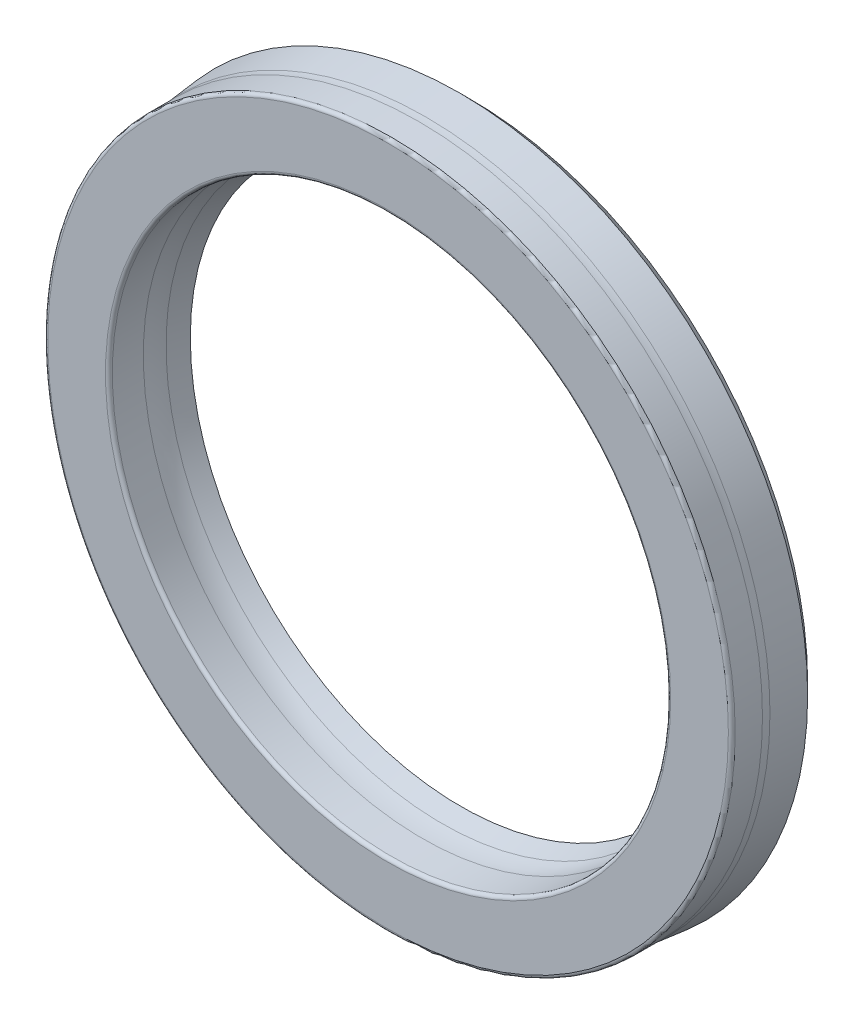
ISO-10303-21;
HEADER;
FILE_DESCRIPTION(('STEP AP214'),'2;1');
FILE_NAME('part.step','',(''),(''),'','','');
FILE_SCHEMA(('AUTOMOTIVE_DESIGN { 1 0 10303 214 1 1 1 1 }'));
ENDSEC;
DATA;
#1=APPLICATION_CONTEXT('core data for automotive mechanical design processes');
#2=APPLICATION_PROTOCOL_DEFINITION('international standard','automotive_design',2000,#1);
#3=PRODUCT_CONTEXT('',#1,'mechanical');
#4=PRODUCT('Part','Part','',(#3));
#5=PRODUCT_RELATED_PRODUCT_CATEGORY('part','',(#4));
#6=PRODUCT_DEFINITION_FORMATION('','',#4);
#7=PRODUCT_DEFINITION_CONTEXT('part definition',#1,'design');
#8=PRODUCT_DEFINITION('design','',#6,#7);
#9=PRODUCT_DEFINITION_SHAPE('','',#8);
#10=(LENGTH_UNIT() NAMED_UNIT(*) SI_UNIT(.MILLI.,.METRE.));
#11=(NAMED_UNIT(*) PLANE_ANGLE_UNIT() SI_UNIT($,.RADIAN.));
#12=(NAMED_UNIT(*) SI_UNIT($,.STERADIAN.) SOLID_ANGLE_UNIT());
#13=UNCERTAINTY_MEASURE_WITH_UNIT(LENGTH_MEASURE(1.E-05),#10,'distance_accuracy_value','');
#14=(GEOMETRIC_REPRESENTATION_CONTEXT(3) GLOBAL_UNCERTAINTY_ASSIGNED_CONTEXT((#13)) GLOBAL_UNIT_ASSIGNED_CONTEXT((#10,
#11,#12)) REPRESENTATION_CONTEXT('',''));
#15=CARTESIAN_POINT('',(0.,0.,0.));
#16=DIRECTION('',(0.,0.,1.));
#17=DIRECTION('',(1.,0.,0.));
#18=AXIS2_PLACEMENT_3D('',#15,#16,#17);
#19=CARTESIAN_POINT('',(0.,0.,-12.));
#20=DIRECTION('',(0.,0.,1.));
#21=DIRECTION('',(1.,0.,0.));
#22=AXIS2_PLACEMENT_3D('',#19,#20,#21);
#23=CONICAL_SURFACE('',#22,49.25,0.785398163397446);
#24=CARTESIAN_POINT('',(0.,0.,-10.5));
#25=DIRECTION('',(0.,0.,1.));
#26=DIRECTION('',(1.,0.,0.));
#27=AXIS2_PLACEMENT_3D('',#24,#25,#26);
#28=CIRCLE('',#27,50.75);
#29=CARTESIAN_POINT('',(50.75,0.,-10.5));
#30=VERTEX_POINT('',#29);
#31=EDGE_CURVE('E95',#30,#30,#28,.T.);
#32=ORIENTED_EDGE('',*,*,#31,.F.);
#33=EDGE_LOOP('',(#32));
#34=FACE_BOUND('',#33,.T.);
#35=CARTESIAN_POINT('',(0.,0.,-12.));
#36=DIRECTION('',(0.,0.,1.));
#37=DIRECTION('',(1.,0.,0.));
#38=AXIS2_PLACEMENT_3D('',#35,#36,#37);
#39=CIRCLE('',#38,49.25);
#40=CARTESIAN_POINT('',(49.25,0.,-12.));
#41=VERTEX_POINT('',#40);
#42=EDGE_CURVE('E10',#41,#41,#39,.T.);
#43=ORIENTED_EDGE('',*,*,#42,.T.);
#44=EDGE_LOOP('',(#43));
#45=FACE_BOUND('',#44,.T.);
#46=ADVANCED_FACE('F43',(#34,#45),#23,.T.);
#47=CARTESIAN_POINT('',(0.,49.25,-12.));
#48=DIRECTION('',(0.,0.,1.));
#49=DIRECTION('',(1.,0.,0.));
#50=AXIS2_PLACEMENT_3D('',#47,#48,#49);
#51=PLANE('',#50);
#52=ORIENTED_EDGE('',*,*,#42,.F.);
#53=EDGE_LOOP('',(#52));
#54=FACE_BOUND('',#53,.T.);
#55=CARTESIAN_POINT('',(0.,0.,-12.));
#56=DIRECTION('',(0.,0.,1.));
#57=DIRECTION('',(1.,0.,0.));
#58=AXIS2_PLACEMENT_3D('',#55,#56,#57);
#59=CIRCLE('',#58,47.5);
#60=CARTESIAN_POINT('',(47.5,0.,-12.));
#61=VERTEX_POINT('',#60);
#62=EDGE_CURVE('E49',#61,#61,#59,.T.);
#63=ORIENTED_EDGE('',*,*,#62,.T.);
#64=EDGE_LOOP('',(#63));
#65=FACE_BOUND('',#64,.T.);
#66=ADVANCED_FACE('F102',(#54,#65),#51,.F.);
#67=CARTESIAN_POINT('',(0.,0.,-7.71142950799845));
#68=DIRECTION('',(0.,0.,-1.));
#69=DIRECTION('',(-1.,0.,0.));
#70=AXIS2_PLACEMENT_3D('',#67,#68,#69);
#71=CONICAL_SURFACE('',#70,46.2074586524472,0.292733477905059);
#72=ORIENTED_EDGE('',*,*,#62,.F.);
#73=EDGE_LOOP('',(#72));
#74=FACE_BOUND('',#73,.T.);
#75=CARTESIAN_POINT('',(0.,0.,-7.71142950799845));
#76=DIRECTION('',(0.,0.,1.));
#77=DIRECTION('',(1.,0.,0.));
#78=AXIS2_PLACEMENT_3D('',#75,#76,#77);
#79=CIRCLE('',#78,46.2074586524472);
#80=CARTESIAN_POINT('',(46.2074586524472,0.,-7.71142950799845));
#81=VERTEX_POINT('',#80);
#82=EDGE_CURVE('E53',#81,#81,#79,.T.);
#83=ORIENTED_EDGE('',*,*,#82,.T.);
#84=EDGE_LOOP('',(#83));
#85=FACE_BOUND('',#84,.T.);
#86=ADVANCED_FACE('F106',(#74,#85),#71,.F.);
#87=CARTESIAN_POINT('',(0.,0.,-8.));
#88=DIRECTION('',(0.,0.,1.));
#89=DIRECTION('',(1.,0.,0.));
#90=AXIS2_PLACEMENT_3D('',#87,#88,#89);
#91=TOROIDAL_SURFACE('',#90,45.25,1.);
#92=ORIENTED_EDGE('',*,*,#82,.F.);
#93=EDGE_LOOP('',(#92));
#94=FACE_BOUND('',#93,.T.);
#95=CARTESIAN_POINT('',(0.,0.,-7.73475386609805));
#96=DIRECTION('',(0.,0.,1.));
#97=DIRECTION('',(1.,0.,0.));
#98=AXIS2_PLACEMENT_3D('',#95,#96,#97);
#99=CIRCLE('',#98,44.2858192656716);
#100=CARTESIAN_POINT('',(44.2858192656716,0.,-7.73475386609805));
#101=VERTEX_POINT('',#100);
#102=EDGE_CURVE('E57',#101,#101,#99,.T.);
#103=ORIENTED_EDGE('',*,*,#102,.T.);
#104=EDGE_LOOP('',(#103));
#105=FACE_BOUND('',#104,.T.);
#106=ADVANCED_FACE('F111',(#94,#105),#91,.F.);
#107=CARTESIAN_POINT('',(0.,0.,-11.5));
#108=DIRECTION('',(0.,0.,1.));
#109=DIRECTION('',(1.,0.,0.));
#110=AXIS2_PLACEMENT_3D('',#107,#108,#109);
#111=CONICAL_SURFACE('',#110,43.25,0.268459191123488);
#112=ORIENTED_EDGE('',*,*,#102,.F.);
#113=EDGE_LOOP('',(#112));
#114=FACE_BOUND('',#113,.T.);
#115=CARTESIAN_POINT('',(0.,0.,-11.5));
#116=DIRECTION('',(0.,0.,1.));
#117=DIRECTION('',(1.,0.,0.));
#118=AXIS2_PLACEMENT_3D('',#115,#116,#117);
#119=CIRCLE('',#118,43.25);
#120=CARTESIAN_POINT('',(43.25,0.,-11.5));
#121=VERTEX_POINT('',#120);
#122=EDGE_CURVE('E62',#121,#121,#119,.T.);
#123=ORIENTED_EDGE('',*,*,#122,.T.);
#124=EDGE_LOOP('',(#123));
#125=FACE_BOUND('',#124,.T.);
#126=ADVANCED_FACE('F117',(#114,#125),#111,.T.);
#127=CARTESIAN_POINT('',(0.,43.25,-11.5));
#128=DIRECTION('',(0.,0.,1.));
#129=DIRECTION('',(1.,0.,0.));
#130=AXIS2_PLACEMENT_3D('',#127,#128,#129);
#131=PLANE('',#130);
#132=ORIENTED_EDGE('',*,*,#122,.F.);
#133=EDGE_LOOP('',(#132));
#134=FACE_BOUND('',#133,.T.);
#135=CARTESIAN_POINT('',(0.,0.,-11.5));
#136=DIRECTION('',(0.,0.,1.));
#137=DIRECTION('',(1.,0.,0.));
#138=AXIS2_PLACEMENT_3D('',#135,#136,#137);
#139=CIRCLE('',#138,41.);
#140=CARTESIAN_POINT('',(41.,0.,-11.5));
#141=VERTEX_POINT('',#140);
#142=EDGE_CURVE('E65',#141,#141,#139,.T.);
#143=ORIENTED_EDGE('',*,*,#142,.T.);
#144=EDGE_LOOP('',(#143));
#145=FACE_BOUND('',#144,.T.);
#146=ADVANCED_FACE('F121',(#134,#145),#131,.F.);
#147=CARTESIAN_POINT('',(0.,0.,-10.6339745962156));
#148=DIRECTION('',(0.,0.,-1.));
#149=DIRECTION('',(-1.,0.,0.));
#150=AXIS2_PLACEMENT_3D('',#147,#148,#149);
#151=CONICAL_SURFACE('',#150,39.5,1.0471975511966);
#152=ORIENTED_EDGE('',*,*,#142,.F.);
#153=EDGE_LOOP('',(#152));
#154=FACE_BOUND('',#153,.T.);
#155=CARTESIAN_POINT('',(0.,0.,-10.6339745962156));
#156=DIRECTION('',(0.,0.,1.));
#157=DIRECTION('',(1.,0.,0.));
#158=AXIS2_PLACEMENT_3D('',#155,#156,#157);
#159=CIRCLE('',#158,39.5);
#160=CARTESIAN_POINT('',(39.5,0.,-10.6339745962156));
#161=VERTEX_POINT('',#160);
#162=EDGE_CURVE('E68',#161,#161,#159,.T.);
#163=ORIENTED_EDGE('',*,*,#162,.T.);
#164=EDGE_LOOP('',(#163));
#165=FACE_BOUND('',#164,.T.);
#166=ADVANCED_FACE('F125',(#154,#165),#151,.F.);
#167=CARTESIAN_POINT('',(0.,0.,-7.91550594394201));
#168=DIRECTION('',(0.,0.,1.));
#169=DIRECTION('',(1.,0.,0.));
#170=AXIS2_PLACEMENT_3D('',#167,#168,#169);
#171=CONICAL_SURFACE('',#170,40.3219900089499,0.293631924423447);
#172=ORIENTED_EDGE('',*,*,#162,.F.);
#173=EDGE_LOOP('',(#172));
#174=FACE_BOUND('',#173,.T.);
#175=CARTESIAN_POINT('',(0.,0.,-7.91550594394201));
#176=DIRECTION('',(0.,0.,1.));
#177=DIRECTION('',(1.,0.,0.));
#178=AXIS2_PLACEMENT_3D('',#175,#176,#177);
#179=CIRCLE('',#178,40.3219900089499);
#180=CARTESIAN_POINT('',(40.3219900089499,0.,-7.91550594394201));
#181=VERTEX_POINT('',#180);
#182=EDGE_CURVE('E71',#181,#181,#179,.T.);
#183=ORIENTED_EDGE('',*,*,#182,.T.);
#184=EDGE_LOOP('',(#183));
#185=FACE_BOUND('',#184,.T.);
#186=ADVANCED_FACE('F129',(#174,#185),#171,.F.);
#187=CARTESIAN_POINT('',(0.,0.,-5.02119993583526));
#188=DIRECTION('',(0.,0.,1.));
#189=DIRECTION('',(1.,0.,0.));
#190=AXIS2_PLACEMENT_3D('',#187,#188,#189);
#191=TOROIDAL_SURFACE('',#190,30.75,9.99999999999999);
#192=ORIENTED_EDGE('',*,*,#182,.F.);
#193=EDGE_LOOP('',(#192));
#194=FACE_BOUND('',#193,.T.);
#195=CARTESIAN_POINT('',(0.,0.,-5.02119993583526));
#196=DIRECTION('',(0.,0.,1.));
#197=DIRECTION('',(1.,0.,0.));
#198=AXIS2_PLACEMENT_3D('',#195,#196,#197);
#199=CIRCLE('',#198,40.75);
#200=CARTESIAN_POINT('',(40.75,0.,-5.02119993583526));
#201=VERTEX_POINT('',#200);
#202=EDGE_CURVE('E74',#201,#201,#199,.T.);
#203=ORIENTED_EDGE('',*,*,#202,.T.);
#204=EDGE_LOOP('',(#203));
#205=FACE_BOUND('',#204,.T.);
#206=ADVANCED_FACE('F133',(#194,#205),#191,.F.);
#207=CARTESIAN_POINT('',(0.,0.,0.));
#208=DIRECTION('',(0.,0.,1.));
#209=DIRECTION('',(1.,0.,0.));
#210=AXIS2_PLACEMENT_3D('',#207,#208,#209);
#211=CYLINDRICAL_SURFACE('',#210,40.75);
#212=ORIENTED_EDGE('',*,*,#202,.F.);
#213=EDGE_LOOP('',(#212));
#214=FACE_BOUND('',#213,.T.);
#215=CARTESIAN_POINT('',(0.,0.,-0.5));
#216=DIRECTION('',(0.,0.,1.));
#217=DIRECTION('',(1.,0.,0.));
#218=AXIS2_PLACEMENT_3D('',#215,#216,#217);
#219=CIRCLE('',#218,40.75);
#220=CARTESIAN_POINT('',(40.75,0.,-0.5));
#221=VERTEX_POINT('',#220);
#222=EDGE_CURVE('E77',#221,#221,#219,.T.);
#223=ORIENTED_EDGE('',*,*,#222,.T.);
#224=EDGE_LOOP('',(#223));
#225=FACE_BOUND('',#224,.T.);
#226=ADVANCED_FACE('F137',(#214,#225),#211,.F.);
#227=CARTESIAN_POINT('',(0.,0.,-0.5));
#228=DIRECTION('',(0.,0.,1.));
#229=DIRECTION('',(1.,0.,0.));
#230=AXIS2_PLACEMENT_3D('',#227,#228,#229);
#231=TOROIDAL_SURFACE('',#230,41.25,0.5);
#232=ORIENTED_EDGE('',*,*,#222,.F.);
#233=EDGE_LOOP('',(#232));
#234=FACE_BOUND('',#233,.T.);
#235=CARTESIAN_POINT('',(0.,0.,0.));
#236=DIRECTION('',(0.,0.,1.));
#237=DIRECTION('',(1.,0.,0.));
#238=AXIS2_PLACEMENT_3D('',#235,#236,#237);
#239=CIRCLE('',#238,41.25);
#240=CARTESIAN_POINT('',(41.25,0.,0.));
#241=VERTEX_POINT('',#240);
#242=EDGE_CURVE('E80',#241,#241,#239,.T.);
#243=ORIENTED_EDGE('',*,*,#242,.T.);
#244=EDGE_LOOP('',(#243));
#245=FACE_BOUND('',#244,.T.);
#246=ADVANCED_FACE('F141',(#234,#245),#231,.T.);
#247=CARTESIAN_POINT('',(0.,41.25,0.));
#248=DIRECTION('',(0.,0.,-1.));
#249=DIRECTION('',(-1.,0.,0.));
#250=AXIS2_PLACEMENT_3D('',#247,#248,#249);
#251=PLANE('',#250);
#252=ORIENTED_EDGE('',*,*,#242,.F.);
#253=EDGE_LOOP('',(#252));
#254=FACE_BOUND('',#253,.T.);
#255=CARTESIAN_POINT('',(0.,0.,0.));
#256=DIRECTION('',(0.,0.,1.));
#257=DIRECTION('',(1.,0.,0.));
#258=AXIS2_PLACEMENT_3D('',#255,#256,#257);
#259=CIRCLE('',#258,49.675);
#260=CARTESIAN_POINT('',(49.675,0.,0.));
#261=VERTEX_POINT('',#260);
#262=EDGE_CURVE('E83',#261,#261,#259,.T.);
#263=ORIENTED_EDGE('',*,*,#262,.T.);
#264=EDGE_LOOP('',(#263));
#265=FACE_BOUND('',#264,.T.);
#266=ADVANCED_FACE('F145',(#254,#265),#251,.F.);
#267=CARTESIAN_POINT('',(0.,0.,-0.5));
#268=DIRECTION('',(0.,0.,1.));
#269=DIRECTION('',(1.,0.,0.));
#270=AXIS2_PLACEMENT_3D('',#267,#268,#269);
#271=TOROIDAL_SURFACE('',#270,49.675,0.5);
#272=ORIENTED_EDGE('',*,*,#262,.F.);
#273=EDGE_LOOP('',(#272));
#274=FACE_BOUND('',#273,.T.);
#275=CARTESIAN_POINT('',(0.,0.,-0.5));
#276=DIRECTION('',(0.,0.,1.));
#277=DIRECTION('',(1.,0.,0.));
#278=AXIS2_PLACEMENT_3D('',#275,#276,#277);
#279=CIRCLE('',#278,50.175);
#280=CARTESIAN_POINT('',(50.175,0.,-0.5));
#281=VERTEX_POINT('',#280);
#282=EDGE_CURVE('E86',#281,#281,#279,.T.);
#283=ORIENTED_EDGE('',*,*,#282,.T.);
#284=EDGE_LOOP('',(#283));
#285=FACE_BOUND('',#284,.T.);
#286=ADVANCED_FACE('F149',(#274,#285),#271,.T.);
#287=CARTESIAN_POINT('',(0.,0.,0.));
#288=DIRECTION('',(0.,0.,1.));
#289=DIRECTION('',(1.,0.,0.));
#290=AXIS2_PLACEMENT_3D('',#287,#288,#289);
#291=CYLINDRICAL_SURFACE('',#290,50.175);
#292=ORIENTED_EDGE('',*,*,#282,.F.);
#293=EDGE_LOOP('',(#292));
#294=FACE_BOUND('',#293,.T.);
#295=CARTESIAN_POINT('',(0.,0.,-4.47869329447006));
#296=DIRECTION('',(0.,0.,1.));
#297=DIRECTION('',(1.,0.,0.));
#298=AXIS2_PLACEMENT_3D('',#295,#296,#297);
#299=CIRCLE('',#298,50.175);
#300=CARTESIAN_POINT('',(50.175,0.,-4.47869329447006));
#301=VERTEX_POINT('',#300);
#302=EDGE_CURVE('E89',#301,#301,#299,.T.);
#303=ORIENTED_EDGE('',*,*,#302,.T.);
#304=EDGE_LOOP('',(#303));
#305=FACE_BOUND('',#304,.T.);
#306=ADVANCED_FACE('F153',(#294,#305),#291,.T.);
#307=CARTESIAN_POINT('',(0.,0.,-4.47869329447006));
#308=DIRECTION('',(0.,0.,1.));
#309=DIRECTION('',(1.,0.,0.));
#310=AXIS2_PLACEMENT_3D('',#307,#308,#309);
#311=TOROIDAL_SURFACE('',#310,60.175,10.);
#312=ORIENTED_EDGE('',*,*,#302,.F.);
#313=EDGE_LOOP('',(#312));
#314=FACE_BOUND('',#313,.T.);
#315=CARTESIAN_POINT('',(0.,0.,-5.51848097145561));
#316=DIRECTION('',(0.,0.,1.));
#317=DIRECTION('',(1.,0.,0.));
#318=AXIS2_PLACEMENT_3D('',#315,#316,#317);
#319=CIRCLE('',#318,50.229204828834);
#320=CARTESIAN_POINT('',(50.229204828834,0.,-5.51848097145561));
#321=VERTEX_POINT('',#320);
#322=EDGE_CURVE('E92',#321,#321,#319,.T.);
#323=ORIENTED_EDGE('',*,*,#322,.T.);
#324=EDGE_LOOP('',(#323));
#325=FACE_BOUND('',#324,.T.);
#326=ADVANCED_FACE('F157',(#314,#325),#311,.F.);
#327=CARTESIAN_POINT('',(0.,0.,-10.5));
#328=DIRECTION('',(0.,0.,-1.));
#329=DIRECTION('',(-1.,0.,0.));
#330=AXIS2_PLACEMENT_3D('',#327,#328,#329);
#331=CONICAL_SURFACE('',#330,50.75,0.10416704769946);
#332=ORIENTED_EDGE('',*,*,#322,.F.);
#333=EDGE_LOOP('',(#332));
#334=FACE_BOUND('',#333,.T.);
#335=ORIENTED_EDGE('',*,*,#31,.T.);
#336=EDGE_LOOP('',(#335));
#337=FACE_BOUND('',#336,.T.);
#338=ADVANCED_FACE('F99',(#334,#337),#331,.T.);
#339=CLOSED_SHELL('',(#46,#66,#86,#106,#126,#146,#166,#186,#206,#226,#246,#266,#286,#306,#326,#338));
#340=MANIFOLD_SOLID_BREP('B2',#339);
#341=ADVANCED_BREP_SHAPE_REPRESENTATION('',(#18,#340),#14);
#342=SHAPE_DEFINITION_REPRESENTATION(#9,#341);
ENDSEC;
END-ISO-10303-21;
